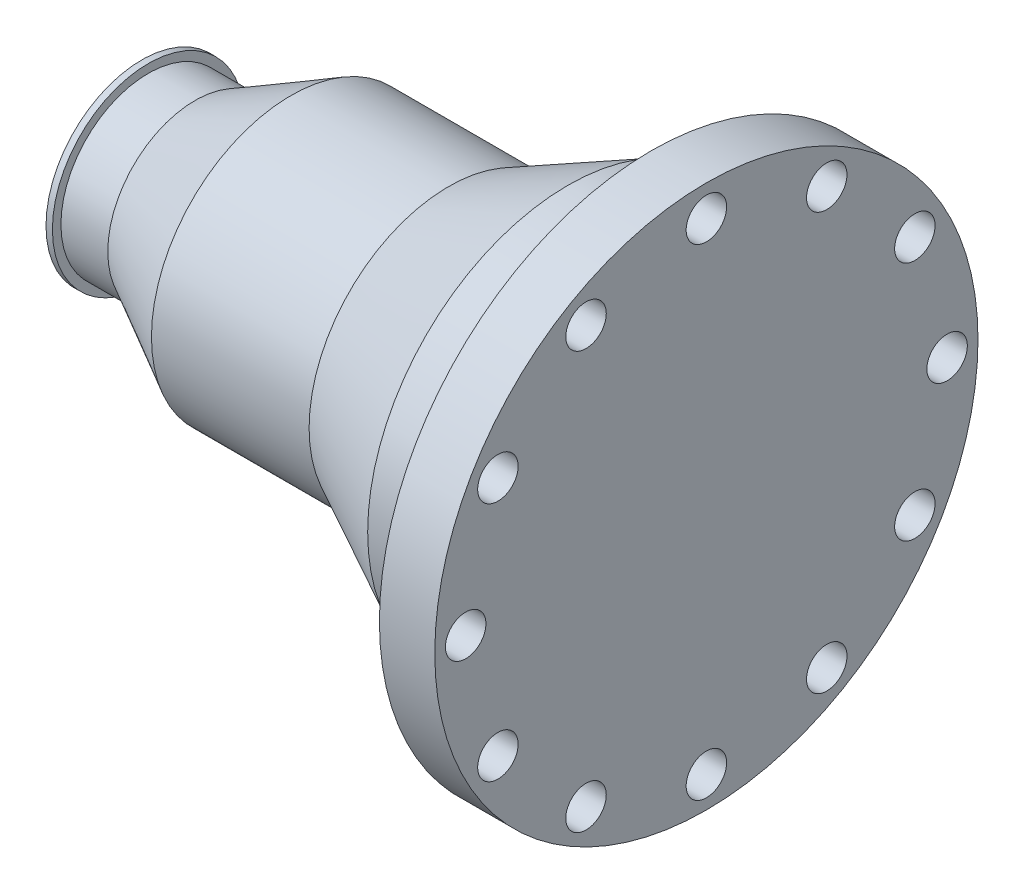
ISO-10303-21;
HEADER;
FILE_DESCRIPTION(('STEP AP214'),'2;1');
FILE_NAME('part.step','',(''),(''),'','','');
FILE_SCHEMA(('AUTOMOTIVE_DESIGN { 1 0 10303 214 1 1 1 1 }'));
ENDSEC;
DATA;
#1=APPLICATION_CONTEXT('core data for automotive mechanical design processes');
#2=APPLICATION_PROTOCOL_DEFINITION('international standard','automotive_design',2000,#1);
#3=PRODUCT_CONTEXT('',#1,'mechanical');
#4=PRODUCT('Part','Part','',(#3));
#5=PRODUCT_RELATED_PRODUCT_CATEGORY('part','',(#4));
#6=PRODUCT_DEFINITION_FORMATION('','',#4);
#7=PRODUCT_DEFINITION_CONTEXT('part definition',#1,'design');
#8=PRODUCT_DEFINITION('design','',#6,#7);
#9=PRODUCT_DEFINITION_SHAPE('','',#8);
#10=(LENGTH_UNIT() NAMED_UNIT(*) SI_UNIT(.MILLI.,.METRE.));
#11=(NAMED_UNIT(*) PLANE_ANGLE_UNIT() SI_UNIT($,.RADIAN.));
#12=(NAMED_UNIT(*) SI_UNIT($,.STERADIAN.) SOLID_ANGLE_UNIT());
#13=UNCERTAINTY_MEASURE_WITH_UNIT(LENGTH_MEASURE(1.E-05),#10,'distance_accuracy_value','');
#14=(GEOMETRIC_REPRESENTATION_CONTEXT(3) GLOBAL_UNCERTAINTY_ASSIGNED_CONTEXT((#13)) GLOBAL_UNIT_ASSIGNED_CONTEXT((#10,
#11,#12)) REPRESENTATION_CONTEXT('',''));
#15=CARTESIAN_POINT('',(0.,0.,0.));
#16=DIRECTION('',(0.,0.,1.));
#17=DIRECTION('',(1.,0.,0.));
#18=AXIS2_PLACEMENT_3D('',#15,#16,#17);
#19=CARTESIAN_POINT('',(0.,0.,0.));
#20=DIRECTION('',(1.,0.,0.));
#21=DIRECTION('',(0.,0.,-1.));
#22=AXIS2_PLACEMENT_3D('',#19,#20,#21);
#23=PLANE('',#22);
#24=CARTESIAN_POINT('',(0.,0.,0.));
#25=DIRECTION('',(-1.,0.,0.));
#26=DIRECTION('',(0.,0.,1.));
#27=AXIS2_PLACEMENT_3D('',#24,#25,#26);
#28=CIRCLE('',#27,31.);
#29=CARTESIAN_POINT('',(0.,0.,31.));
#30=VERTEX_POINT('',#29);
#31=EDGE_CURVE('E80',#30,#30,#28,.T.);
#32=ORIENTED_EDGE('',*,*,#31,.F.);
#33=EDGE_LOOP('',(#32));
#34=FACE_BOUND('',#33,.T.);
#35=CARTESIAN_POINT('',(0.,0.,0.));
#36=DIRECTION('',(-1.,0.,0.));
#37=DIRECTION('',(0.,0.,1.));
#38=AXIS2_PLACEMENT_3D('',#35,#36,#37);
#39=CIRCLE('',#38,45.);
#40=CARTESIAN_POINT('',(0.,0.,45.));
#41=VERTEX_POINT('',#40);
#42=EDGE_CURVE('E10',#41,#41,#39,.T.);
#43=ORIENTED_EDGE('',*,*,#42,.T.);
#44=EDGE_LOOP('',(#43));
#45=FACE_BOUND('',#44,.T.);
#46=ADVANCED_FACE('F37',(#34,#45),#23,.F.);
#47=CARTESIAN_POINT('',(0.,0.,0.));
#48=DIRECTION('',(-1.,0.,0.));
#49=DIRECTION('',(0.,0.,1.));
#50=AXIS2_PLACEMENT_3D('',#47,#48,#49);
#51=CYLINDRICAL_SURFACE('',#50,45.);
#52=ORIENTED_EDGE('',*,*,#42,.F.);
#53=EDGE_LOOP('',(#52));
#54=FACE_BOUND('',#53,.T.);
#55=CARTESIAN_POINT('',(3.,0.,0.));
#56=DIRECTION('',(-1.,0.,0.));
#57=DIRECTION('',(0.,0.,1.));
#58=AXIS2_PLACEMENT_3D('',#55,#56,#57);
#59=CIRCLE('',#58,45.);
#60=CARTESIAN_POINT('',(3.,0.,45.));
#61=VERTEX_POINT('',#60);
#62=EDGE_CURVE('E43',#61,#61,#59,.T.);
#63=ORIENTED_EDGE('',*,*,#62,.T.);
#64=EDGE_LOOP('',(#63));
#65=FACE_BOUND('',#64,.T.);
#66=ADVANCED_FACE('F226',(#54,#65),#51,.T.);
#67=CARTESIAN_POINT('',(3.,45.,0.));
#68=DIRECTION('',(-1.,0.,0.));
#69=DIRECTION('',(0.,0.,1.));
#70=AXIS2_PLACEMENT_3D('',#67,#68,#69);
#71=PLANE('',#70);
#72=ORIENTED_EDGE('',*,*,#62,.F.);
#73=EDGE_LOOP('',(#72));
#74=FACE_BOUND('',#73,.T.);
#75=CARTESIAN_POINT('',(3.,0.,0.));
#76=DIRECTION('',(-1.,0.,0.));
#77=DIRECTION('',(0.,0.,1.));
#78=AXIS2_PLACEMENT_3D('',#75,#76,#77);
#79=CIRCLE('',#78,41.);
#80=CARTESIAN_POINT('',(3.,0.,41.));
#81=VERTEX_POINT('',#80);
#82=EDGE_CURVE('E47',#81,#81,#79,.T.);
#83=ORIENTED_EDGE('',*,*,#82,.T.);
#84=EDGE_LOOP('',(#83));
#85=FACE_BOUND('',#84,.T.);
#86=ADVANCED_FACE('F232',(#74,#85),#71,.F.);
#87=CARTESIAN_POINT('',(0.,0.,0.));
#88=DIRECTION('',(-1.,0.,0.));
#89=DIRECTION('',(0.,0.,1.));
#90=AXIS2_PLACEMENT_3D('',#87,#88,#89);
#91=CYLINDRICAL_SURFACE('',#90,41.);
#92=ORIENTED_EDGE('',*,*,#82,.F.);
#93=EDGE_LOOP('',(#92));
#94=FACE_BOUND('',#93,.T.);
#95=CARTESIAN_POINT('',(25.,0.,0.));
#96=DIRECTION('',(-1.,0.,0.));
#97=DIRECTION('',(0.,0.,1.));
#98=AXIS2_PLACEMENT_3D('',#95,#96,#97);
#99=CIRCLE('',#98,41.);
#100=CARTESIAN_POINT('',(25.,0.,41.));
#101=VERTEX_POINT('',#100);
#102=EDGE_CURVE('E51',#101,#101,#99,.T.);
#103=ORIENTED_EDGE('',*,*,#102,.T.);
#104=EDGE_LOOP('',(#103));
#105=FACE_BOUND('',#104,.T.);
#106=ADVANCED_FACE('F514',(#94,#105),#91,.T.);
#107=CARTESIAN_POINT('',(70.,0.,0.));
#108=DIRECTION('',(1.,0.,0.));
#109=DIRECTION('',(0.,0.,-1.));
#110=AXIS2_PLACEMENT_3D('',#107,#108,#109);
#111=CONICAL_SURFACE('',#110,65.5,0.498567905638218);
#112=ORIENTED_EDGE('',*,*,#102,.F.);
#113=EDGE_LOOP('',(#112));
#114=FACE_BOUND('',#113,.T.);
#115=CARTESIAN_POINT('',(70.,0.,0.));
#116=DIRECTION('',(-1.,0.,0.));
#117=DIRECTION('',(0.,0.,1.));
#118=AXIS2_PLACEMENT_3D('',#115,#116,#117);
#119=CIRCLE('',#118,65.5);
#120=CARTESIAN_POINT('',(70.,0.,65.5));
#121=VERTEX_POINT('',#120);
#122=EDGE_CURVE('E56',#121,#121,#119,.T.);
#123=ORIENTED_EDGE('',*,*,#122,.T.);
#124=EDGE_LOOP('',(#123));
#125=FACE_BOUND('',#124,.T.);
#126=ADVANCED_FACE('F505',(#114,#125),#111,.T.);
#127=CARTESIAN_POINT('',(0.,0.,0.));
#128=DIRECTION('',(-1.,0.,0.));
#129=DIRECTION('',(0.,0.,1.));
#130=AXIS2_PLACEMENT_3D('',#127,#128,#129);
#131=CYLINDRICAL_SURFACE('',#130,65.5);
#132=ORIENTED_EDGE('',*,*,#122,.F.);
#133=EDGE_LOOP('',(#132));
#134=FACE_BOUND('',#133,.T.);
#135=CARTESIAN_POINT('',(144.,0.,0.));
#136=DIRECTION('',(-1.,0.,0.));
#137=DIRECTION('',(0.,0.,1.));
#138=AXIS2_PLACEMENT_3D('',#135,#136,#137);
#139=CIRCLE('',#138,65.5);
#140=CARTESIAN_POINT('',(144.,0.,65.5));
#141=VERTEX_POINT('',#140);
#142=EDGE_CURVE('E59',#141,#141,#139,.T.);
#143=ORIENTED_EDGE('',*,*,#142,.T.);
#144=EDGE_LOOP('',(#143));
#145=FACE_BOUND('',#144,.T.);
#146=ADVANCED_FACE('F496',(#134,#145),#131,.T.);
#147=CARTESIAN_POINT('',(200.,0.,0.));
#148=DIRECTION('',(1.,0.,0.));
#149=DIRECTION('',(0.,0.,-1.));
#150=AXIS2_PLACEMENT_3D('',#147,#148,#149);
#151=CONICAL_SURFACE('',#150,94.,0.470764926542016);
#152=ORIENTED_EDGE('',*,*,#142,.F.);
#153=EDGE_LOOP('',(#152));
#154=FACE_BOUND('',#153,.T.);
#155=CARTESIAN_POINT('',(200.,0.,0.));
#156=DIRECTION('',(-1.,0.,0.));
#157=DIRECTION('',(0.,0.,1.));
#158=AXIS2_PLACEMENT_3D('',#155,#156,#157);
#159=CIRCLE('',#158,94.);
#160=CARTESIAN_POINT('',(200.,0.,94.));
#161=VERTEX_POINT('',#160);
#162=EDGE_CURVE('E62',#161,#161,#159,.T.);
#163=ORIENTED_EDGE('',*,*,#162,.T.);
#164=EDGE_LOOP('',(#163));
#165=FACE_BOUND('',#164,.T.);
#166=ADVANCED_FACE('F487',(#154,#165),#151,.T.);
#167=CARTESIAN_POINT('',(0.,0.,0.));
#168=DIRECTION('',(-1.,0.,0.));
#169=DIRECTION('',(0.,0.,1.));
#170=AXIS2_PLACEMENT_3D('',#167,#168,#169);
#171=CYLINDRICAL_SURFACE('',#170,94.);
#172=ORIENTED_EDGE('',*,*,#162,.F.);
#173=EDGE_LOOP('',(#172));
#174=FACE_BOUND('',#173,.T.);
#175=CARTESIAN_POINT('',(220.,0.,0.));
#176=DIRECTION('',(-1.,0.,0.));
#177=DIRECTION('',(0.,0.,1.));
#178=AXIS2_PLACEMENT_3D('',#175,#176,#177);
#179=CIRCLE('',#178,94.);
#180=CARTESIAN_POINT('',(220.,0.,94.));
#181=VERTEX_POINT('',#180);
#182=EDGE_CURVE('E65',#181,#181,#179,.T.);
#183=ORIENTED_EDGE('',*,*,#182,.T.);
#184=EDGE_LOOP('',(#183));
#185=FACE_BOUND('',#184,.T.);
#186=ADVANCED_FACE('F478',(#174,#185),#171,.T.);
#187=CARTESIAN_POINT('',(220.,94.,0.));
#188=DIRECTION('',(1.,0.,0.));
#189=DIRECTION('',(0.,0.,-1.));
#190=AXIS2_PLACEMENT_3D('',#187,#188,#189);
#191=PLANE('',#190);
#192=ORIENTED_EDGE('',*,*,#182,.F.);
#193=EDGE_LOOP('',(#192));
#194=FACE_BOUND('',#193,.T.);
#195=CARTESIAN_POINT('',(220.,0.,0.));
#196=DIRECTION('',(-1.,0.,0.));
#197=DIRECTION('',(0.,0.,1.));
#198=AXIS2_PLACEMENT_3D('',#195,#196,#197);
#199=CIRCLE('',#198,95.);
#200=CARTESIAN_POINT('',(220.,0.,95.));
#201=VERTEX_POINT('',#200);
#202=EDGE_CURVE('E68',#201,#201,#199,.T.);
#203=ORIENTED_EDGE('',*,*,#202,.T.);
#204=EDGE_LOOP('',(#203));
#205=FACE_BOUND('',#204,.T.);
#206=ADVANCED_FACE('F469',(#194,#205),#191,.F.);
#207=CARTESIAN_POINT('',(0.,0.,0.));
#208=DIRECTION('',(-1.,0.,0.));
#209=DIRECTION('',(0.,0.,1.));
#210=AXIS2_PLACEMENT_3D('',#207,#208,#209);
#211=CYLINDRICAL_SURFACE('',#210,95.);
#212=ORIENTED_EDGE('',*,*,#202,.F.);
#213=EDGE_LOOP('',(#212));
#214=FACE_BOUND('',#213,.T.);
#215=CARTESIAN_POINT('',(239.,0.,0.));
#216=DIRECTION('',(-1.,0.,0.));
#217=DIRECTION('',(0.,0.,1.));
#218=AXIS2_PLACEMENT_3D('',#215,#216,#217);
#219=CIRCLE('',#218,95.);
#220=CARTESIAN_POINT('',(239.,0.,95.));
#221=VERTEX_POINT('',#220);
#222=EDGE_CURVE('E71',#221,#221,#219,.T.);
#223=ORIENTED_EDGE('',*,*,#222,.T.);
#224=EDGE_LOOP('',(#223));
#225=FACE_BOUND('',#224,.T.);
#226=ADVANCED_FACE('F222',(#214,#225),#211,.T.);
#227=CARTESIAN_POINT('',(239.,100.,0.));
#228=DIRECTION('',(1.,0.,0.));
#229=DIRECTION('',(0.,0.,-1.));
#230=AXIS2_PLACEMENT_3D('',#227,#228,#229);
#231=PLANE('',#230);
#232=CARTESIAN_POINT('',(239.,97.8608706276416,-56.5));
#233=DIRECTION('',(1.,0.,0.));
#234=DIRECTION('',(0.,0.,-1.));
#235=AXIS2_PLACEMENT_3D('',#232,#233,#234);
#236=CIRCLE('',#235,9.50000000000001);
#237=CARTESIAN_POINT('',(239.,97.8608706276416,-66.));
#238=VERTEX_POINT('',#237);
#239=EDGE_CURVE('E173',#238,#238,#236,.F.);
#240=ORIENTED_EDGE('',*,*,#239,.F.);
#241=EDGE_LOOP('',(#240));
#242=FACE_BOUND('',#241,.T.);
#243=CARTESIAN_POINT('',(239.,56.4999999999999,-97.8608706276416));
#244=DIRECTION('',(1.,0.,0.));
#245=DIRECTION('',(0.,0.,-1.));
#246=AXIS2_PLACEMENT_3D('',#243,#244,#245);
#247=CIRCLE('',#246,9.5);
#248=CARTESIAN_POINT('',(239.,56.4999999999999,-107.360870627642));
#249=VERTEX_POINT('',#248);
#250=EDGE_CURVE('E167',#249,#249,#247,.F.);
#251=ORIENTED_EDGE('',*,*,#250,.F.);
#252=EDGE_LOOP('',(#251));
#253=FACE_BOUND('',#252,.T.);
#254=CARTESIAN_POINT('',(239.,0.,-113.));
#255=DIRECTION('',(1.,0.,0.));
#256=DIRECTION('',(0.,0.,-1.));
#257=AXIS2_PLACEMENT_3D('',#254,#255,#256);
#258=CIRCLE('',#257,9.49999999999999);
#259=CARTESIAN_POINT('',(239.,0.,-122.5));
#260=VERTEX_POINT('',#259);
#261=EDGE_CURVE('E161',#260,#260,#258,.F.);
#262=ORIENTED_EDGE('',*,*,#261,.F.);
#263=EDGE_LOOP('',(#262));
#264=FACE_BOUND('',#263,.T.);
#265=CARTESIAN_POINT('',(239.,-56.5,-97.8608706276415));
#266=DIRECTION('',(1.,0.,0.));
#267=DIRECTION('',(0.,0.,-1.));
#268=AXIS2_PLACEMENT_3D('',#265,#266,#267);
#269=CIRCLE('',#268,9.5);
#270=CARTESIAN_POINT('',(239.,-56.5,-107.360870627642));
#271=VERTEX_POINT('',#270);
#272=EDGE_CURVE('E155',#271,#271,#269,.F.);
#273=ORIENTED_EDGE('',*,*,#272,.F.);
#274=EDGE_LOOP('',(#273));
#275=FACE_BOUND('',#274,.T.);
#276=CARTESIAN_POINT('',(239.,-97.8608706276416,-56.5));
#277=DIRECTION('',(1.,0.,0.));
#278=DIRECTION('',(0.,0.,-1.));
#279=AXIS2_PLACEMENT_3D('',#276,#277,#278);
#280=CIRCLE('',#279,9.50000000000001);
#281=CARTESIAN_POINT('',(239.,-97.8608706276416,-66.));
#282=VERTEX_POINT('',#281);
#283=EDGE_CURVE('E149',#282,#282,#280,.F.);
#284=ORIENTED_EDGE('',*,*,#283,.F.);
#285=EDGE_LOOP('',(#284));
#286=FACE_BOUND('',#285,.T.);
#287=CARTESIAN_POINT('',(239.,-113.,0.));
#288=DIRECTION('',(1.,0.,0.));
#289=DIRECTION('',(0.,0.,-1.));
#290=AXIS2_PLACEMENT_3D('',#287,#288,#289);
#291=CIRCLE('',#290,9.49999999999998);
#292=CARTESIAN_POINT('',(239.,-113.,-9.49999999999998));
#293=VERTEX_POINT('',#292);
#294=EDGE_CURVE('E143',#293,#293,#291,.F.);
#295=ORIENTED_EDGE('',*,*,#294,.F.);
#296=EDGE_LOOP('',(#295));
#297=FACE_BOUND('',#296,.T.);
#298=CARTESIAN_POINT('',(239.,-97.8608706276415,56.5));
#299=DIRECTION('',(1.,0.,0.));
#300=DIRECTION('',(0.,0.,-1.));
#301=AXIS2_PLACEMENT_3D('',#298,#299,#300);
#302=CIRCLE('',#301,9.5);
#303=CARTESIAN_POINT('',(239.,-97.8608706276415,47.));
#304=VERTEX_POINT('',#303);
#305=EDGE_CURVE('E137',#304,#304,#302,.F.);
#306=ORIENTED_EDGE('',*,*,#305,.F.);
#307=EDGE_LOOP('',(#306));
#308=FACE_BOUND('',#307,.T.);
#309=CARTESIAN_POINT('',(239.,-56.5,97.8608706276416));
#310=DIRECTION('',(1.,0.,0.));
#311=DIRECTION('',(0.,0.,-1.));
#312=AXIS2_PLACEMENT_3D('',#309,#310,#311);
#313=CIRCLE('',#312,9.5);
#314=CARTESIAN_POINT('',(239.,-56.5,88.3608706276416));
#315=VERTEX_POINT('',#314);
#316=EDGE_CURVE('E131',#315,#315,#313,.F.);
#317=ORIENTED_EDGE('',*,*,#316,.F.);
#318=EDGE_LOOP('',(#317));
#319=FACE_BOUND('',#318,.T.);
#320=CARTESIAN_POINT('',(239.,0.,113.));
#321=DIRECTION('',(1.,0.,0.));
#322=DIRECTION('',(0.,0.,-1.));
#323=AXIS2_PLACEMENT_3D('',#320,#321,#322);
#324=CIRCLE('',#323,9.49999999999999);
#325=CARTESIAN_POINT('',(239.,0.,103.5));
#326=VERTEX_POINT('',#325);
#327=EDGE_CURVE('E125',#326,#326,#324,.F.);
#328=ORIENTED_EDGE('',*,*,#327,.F.);
#329=EDGE_LOOP('',(#328));
#330=FACE_BOUND('',#329,.T.);
#331=CARTESIAN_POINT('',(239.,56.5,97.8608706276416));
#332=DIRECTION('',(1.,0.,0.));
#333=DIRECTION('',(0.,0.,-1.));
#334=AXIS2_PLACEMENT_3D('',#331,#332,#333);
#335=CIRCLE('',#334,9.5);
#336=CARTESIAN_POINT('',(239.,56.5,88.3608706276416));
#337=VERTEX_POINT('',#336);
#338=EDGE_CURVE('E119',#337,#337,#335,.F.);
#339=ORIENTED_EDGE('',*,*,#338,.F.);
#340=EDGE_LOOP('',(#339));
#341=FACE_BOUND('',#340,.T.);
#342=CARTESIAN_POINT('',(239.,97.8608706276416,56.5));
#343=DIRECTION('',(1.,0.,0.));
#344=DIRECTION('',(0.,0.,-1.));
#345=AXIS2_PLACEMENT_3D('',#342,#343,#344);
#346=CIRCLE('',#345,9.5);
#347=CARTESIAN_POINT('',(239.,97.8608706276416,47.));
#348=VERTEX_POINT('',#347);
#349=EDGE_CURVE('E113',#348,#348,#346,.F.);
#350=ORIENTED_EDGE('',*,*,#349,.F.);
#351=EDGE_LOOP('',(#350));
#352=FACE_BOUND('',#351,.T.);
#353=CARTESIAN_POINT('',(239.,113.,0.));
#354=DIRECTION('',(1.,0.,0.));
#355=DIRECTION('',(0.,0.,-1.));
#356=AXIS2_PLACEMENT_3D('',#353,#354,#355);
#357=CIRCLE('',#356,9.50000000000001);
#358=CARTESIAN_POINT('',(239.,113.,-9.50000000000001));
#359=VERTEX_POINT('',#358);
#360=EDGE_CURVE('E107',#359,#359,#357,.F.);
#361=ORIENTED_EDGE('',*,*,#360,.F.);
#362=EDGE_LOOP('',(#361));
#363=FACE_BOUND('',#362,.T.);
#364=ORIENTED_EDGE('',*,*,#222,.F.);
#365=EDGE_LOOP('',(#364));
#366=FACE_BOUND('',#365,.T.);
#367=CARTESIAN_POINT('',(239.,0.,0.));
#368=DIRECTION('',(-1.,0.,0.));
#369=DIRECTION('',(0.,0.,1.));
#370=AXIS2_PLACEMENT_3D('',#367,#368,#369);
#371=CIRCLE('',#370,127.5);
#372=CARTESIAN_POINT('',(239.,0.,127.5));
#373=VERTEX_POINT('',#372);
#374=EDGE_CURVE('E74',#373,#373,#371,.T.);
#375=ORIENTED_EDGE('',*,*,#374,.T.);
#376=EDGE_LOOP('',(#375));
#377=FACE_BOUND('',#376,.T.);
#378=ADVANCED_FACE('F214',(#242,#253,#264,#275,#286,#297,#308,#319,#330,#341,#352,#363,#366,
#377),#231,.F.);
#379=CARTESIAN_POINT('',(0.,0.,0.));
#380=DIRECTION('',(-1.,0.,0.));
#381=DIRECTION('',(0.,0.,1.));
#382=AXIS2_PLACEMENT_3D('',#379,#380,#381);
#383=CYLINDRICAL_SURFACE('',#382,127.5);
#384=ORIENTED_EDGE('',*,*,#374,.F.);
#385=EDGE_LOOP('',(#384));
#386=FACE_BOUND('',#385,.T.);
#387=CARTESIAN_POINT('',(265.,0.,0.));
#388=DIRECTION('',(-1.,0.,0.));
#389=DIRECTION('',(0.,0.,1.));
#390=AXIS2_PLACEMENT_3D('',#387,#388,#389);
#391=CIRCLE('',#390,127.5);
#392=CARTESIAN_POINT('',(265.,0.,127.5));
#393=VERTEX_POINT('',#392);
#394=EDGE_CURVE('E77',#393,#393,#391,.T.);
#395=ORIENTED_EDGE('',*,*,#394,.T.);
#396=EDGE_LOOP('',(#395));
#397=FACE_BOUND('',#396,.T.);
#398=ADVANCED_FACE('F187',(#386,#397),#383,.T.);
#399=CARTESIAN_POINT('',(265.,127.5,0.));
#400=DIRECTION('',(-1.,0.,0.));
#401=DIRECTION('',(0.,0.,1.));
#402=AXIS2_PLACEMENT_3D('',#399,#400,#401);
#403=PLANE('',#402);
#404=CARTESIAN_POINT('',(265.,97.8608706276416,-56.5));
#405=DIRECTION('',(1.,0.,0.));
#406=DIRECTION('',(0.,0.,-1.));
#407=AXIS2_PLACEMENT_3D('',#404,#405,#406);
#408=CIRCLE('',#407,9.50000000000001);
#409=CARTESIAN_POINT('',(265.,97.8608706276416,-66.));
#410=VERTEX_POINT('',#409);
#411=EDGE_CURVE('E176',#410,#410,#408,.T.);
#412=ORIENTED_EDGE('',*,*,#411,.F.);
#413=EDGE_LOOP('',(#412));
#414=FACE_BOUND('',#413,.T.);
#415=CARTESIAN_POINT('',(265.,56.4999999999999,-97.8608706276416));
#416=DIRECTION('',(1.,0.,0.));
#417=DIRECTION('',(0.,0.,-1.));
#418=AXIS2_PLACEMENT_3D('',#415,#416,#417);
#419=CIRCLE('',#418,9.5);
#420=CARTESIAN_POINT('',(265.,56.4999999999999,-107.360870627642));
#421=VERTEX_POINT('',#420);
#422=EDGE_CURVE('E170',#421,#421,#419,.T.);
#423=ORIENTED_EDGE('',*,*,#422,.F.);
#424=EDGE_LOOP('',(#423));
#425=FACE_BOUND('',#424,.T.);
#426=CARTESIAN_POINT('',(265.,0.,-113.));
#427=DIRECTION('',(1.,0.,0.));
#428=DIRECTION('',(0.,0.,-1.));
#429=AXIS2_PLACEMENT_3D('',#426,#427,#428);
#430=CIRCLE('',#429,9.49999999999999);
#431=CARTESIAN_POINT('',(265.,0.,-122.5));
#432=VERTEX_POINT('',#431);
#433=EDGE_CURVE('E164',#432,#432,#430,.T.);
#434=ORIENTED_EDGE('',*,*,#433,.F.);
#435=EDGE_LOOP('',(#434));
#436=FACE_BOUND('',#435,.T.);
#437=CARTESIAN_POINT('',(265.,-56.5,-97.8608706276415));
#438=DIRECTION('',(1.,0.,0.));
#439=DIRECTION('',(0.,0.,-1.));
#440=AXIS2_PLACEMENT_3D('',#437,#438,#439);
#441=CIRCLE('',#440,9.5);
#442=CARTESIAN_POINT('',(265.,-56.5,-107.360870627642));
#443=VERTEX_POINT('',#442);
#444=EDGE_CURVE('E158',#443,#443,#441,.T.);
#445=ORIENTED_EDGE('',*,*,#444,.F.);
#446=EDGE_LOOP('',(#445));
#447=FACE_BOUND('',#446,.T.);
#448=CARTESIAN_POINT('',(265.,-97.8608706276416,-56.5));
#449=DIRECTION('',(1.,0.,0.));
#450=DIRECTION('',(0.,0.,-1.));
#451=AXIS2_PLACEMENT_3D('',#448,#449,#450);
#452=CIRCLE('',#451,9.50000000000001);
#453=CARTESIAN_POINT('',(265.,-97.8608706276416,-66.));
#454=VERTEX_POINT('',#453);
#455=EDGE_CURVE('E152',#454,#454,#452,.T.);
#456=ORIENTED_EDGE('',*,*,#455,.F.);
#457=EDGE_LOOP('',(#456));
#458=FACE_BOUND('',#457,.T.);
#459=CARTESIAN_POINT('',(265.,-113.,0.));
#460=DIRECTION('',(1.,0.,0.));
#461=DIRECTION('',(0.,0.,-1.));
#462=AXIS2_PLACEMENT_3D('',#459,#460,#461);
#463=CIRCLE('',#462,9.49999999999998);
#464=CARTESIAN_POINT('',(265.,-113.,-9.49999999999998));
#465=VERTEX_POINT('',#464);
#466=EDGE_CURVE('E146',#465,#465,#463,.T.);
#467=ORIENTED_EDGE('',*,*,#466,.F.);
#468=EDGE_LOOP('',(#467));
#469=FACE_BOUND('',#468,.T.);
#470=CARTESIAN_POINT('',(265.,-97.8608706276415,56.5));
#471=DIRECTION('',(1.,0.,0.));
#472=DIRECTION('',(0.,0.,-1.));
#473=AXIS2_PLACEMENT_3D('',#470,#471,#472);
#474=CIRCLE('',#473,9.5);
#475=CARTESIAN_POINT('',(265.,-97.8608706276415,47.));
#476=VERTEX_POINT('',#475);
#477=EDGE_CURVE('E140',#476,#476,#474,.T.);
#478=ORIENTED_EDGE('',*,*,#477,.F.);
#479=EDGE_LOOP('',(#478));
#480=FACE_BOUND('',#479,.T.);
#481=CARTESIAN_POINT('',(265.,-56.5,97.8608706276416));
#482=DIRECTION('',(1.,0.,0.));
#483=DIRECTION('',(0.,0.,-1.));
#484=AXIS2_PLACEMENT_3D('',#481,#482,#483);
#485=CIRCLE('',#484,9.5);
#486=CARTESIAN_POINT('',(265.,-56.5,88.3608706276416));
#487=VERTEX_POINT('',#486);
#488=EDGE_CURVE('E134',#487,#487,#485,.T.);
#489=ORIENTED_EDGE('',*,*,#488,.F.);
#490=EDGE_LOOP('',(#489));
#491=FACE_BOUND('',#490,.T.);
#492=CARTESIAN_POINT('',(265.,0.,113.));
#493=DIRECTION('',(1.,0.,0.));
#494=DIRECTION('',(0.,0.,-1.));
#495=AXIS2_PLACEMENT_3D('',#492,#493,#494);
#496=CIRCLE('',#495,9.49999999999999);
#497=CARTESIAN_POINT('',(265.,0.,103.5));
#498=VERTEX_POINT('',#497);
#499=EDGE_CURVE('E128',#498,#498,#496,.T.);
#500=ORIENTED_EDGE('',*,*,#499,.F.);
#501=EDGE_LOOP('',(#500));
#502=FACE_BOUND('',#501,.T.);
#503=CARTESIAN_POINT('',(265.,56.5,97.8608706276416));
#504=DIRECTION('',(1.,0.,0.));
#505=DIRECTION('',(0.,0.,-1.));
#506=AXIS2_PLACEMENT_3D('',#503,#504,#505);
#507=CIRCLE('',#506,9.5);
#508=CARTESIAN_POINT('',(265.,56.5,88.3608706276416));
#509=VERTEX_POINT('',#508);
#510=EDGE_CURVE('E122',#509,#509,#507,.T.);
#511=ORIENTED_EDGE('',*,*,#510,.F.);
#512=EDGE_LOOP('',(#511));
#513=FACE_BOUND('',#512,.T.);
#514=CARTESIAN_POINT('',(265.,97.8608706276416,56.5));
#515=DIRECTION('',(1.,0.,0.));
#516=DIRECTION('',(0.,0.,-1.));
#517=AXIS2_PLACEMENT_3D('',#514,#515,#516);
#518=CIRCLE('',#517,9.5);
#519=CARTESIAN_POINT('',(265.,97.8608706276416,47.));
#520=VERTEX_POINT('',#519);
#521=EDGE_CURVE('E116',#520,#520,#518,.T.);
#522=ORIENTED_EDGE('',*,*,#521,.F.);
#523=EDGE_LOOP('',(#522));
#524=FACE_BOUND('',#523,.T.);
#525=CARTESIAN_POINT('',(265.,113.,0.));
#526=DIRECTION('',(1.,0.,0.));
#527=DIRECTION('',(0.,0.,-1.));
#528=AXIS2_PLACEMENT_3D('',#525,#526,#527);
#529=CIRCLE('',#528,9.50000000000001);
#530=CARTESIAN_POINT('',(265.,113.,-9.50000000000001));
#531=VERTEX_POINT('',#530);
#532=EDGE_CURVE('E110',#531,#531,#529,.T.);
#533=ORIENTED_EDGE('',*,*,#532,.F.);
#534=EDGE_LOOP('',(#533));
#535=FACE_BOUND('',#534,.T.);
#536=ORIENTED_EDGE('',*,*,#394,.F.);
#537=EDGE_LOOP('',(#536));
#538=FACE_BOUND('',#537,.T.);
#539=ADVANCED_FACE('F183',(#414,#425,#436,#447,#458,#469,#480,#491,#502,#513,#524,#535,#538),
#403,.F.);
#540=CARTESIAN_POINT('',(0.,0.,0.));
#541=DIRECTION('',(-1.,0.,0.));
#542=DIRECTION('',(0.,0.,1.));
#543=AXIS2_PLACEMENT_3D('',#540,#541,#542);
#544=CYLINDRICAL_SURFACE('',#543,31.);
#545=ORIENTED_EDGE('',*,*,#31,.T.);
#546=EDGE_LOOP('',(#545));
#547=FACE_BOUND('',#546,.T.);
#548=CARTESIAN_POINT('',(42.,0.,0.));
#549=DIRECTION('',(-1.,0.,0.));
#550=DIRECTION('',(0.,0.,1.));
#551=AXIS2_PLACEMENT_3D('',#548,#549,#550);
#552=CIRCLE('',#551,31.);
#553=CARTESIAN_POINT('',(42.,0.,31.));
#554=VERTEX_POINT('',#553);
#555=EDGE_CURVE('E83',#554,#554,#552,.T.);
#556=ORIENTED_EDGE('',*,*,#555,.F.);
#557=EDGE_LOOP('',(#556));
#558=FACE_BOUND('',#557,.T.);
#559=ADVANCED_FACE('F186',(#547,#558),#544,.F.);
#560=CARTESIAN_POINT('',(70.,0.,0.));
#561=DIRECTION('',(1.,0.,0.));
#562=DIRECTION('',(0.,0.,-1.));
#563=AXIS2_PLACEMENT_3D('',#560,#561,#562);
#564=CONICAL_SURFACE('',#563,38.502577,0.261799374867879);
#565=ORIENTED_EDGE('',*,*,#555,.T.);
#566=EDGE_LOOP('',(#565));
#567=FACE_BOUND('',#566,.T.);
#568=CARTESIAN_POINT('',(70.,0.,0.));
#569=DIRECTION('',(-1.,0.,0.));
#570=DIRECTION('',(0.,0.,1.));
#571=AXIS2_PLACEMENT_3D('',#568,#569,#570);
#572=CIRCLE('',#571,38.502577);
#573=CARTESIAN_POINT('',(70.,0.,38.502577));
#574=VERTEX_POINT('',#573);
#575=EDGE_CURVE('E86',#574,#574,#572,.T.);
#576=ORIENTED_EDGE('',*,*,#575,.F.);
#577=EDGE_LOOP('',(#576));
#578=FACE_BOUND('',#577,.T.);
#579=ADVANCED_FACE('F237',(#567,#578),#564,.F.);
#580=CARTESIAN_POINT('',(107.802202951022,0.,0.));
#581=DIRECTION('',(-1.,0.,0.));
#582=DIRECTION('',(0.,0.,1.));
#583=AXIS2_PLACEMENT_3D('',#580,#581,#582);
#584=DEGENERATE_TOROIDAL_SURFACE('',#583,5.77654352226822,49.9999981513586,.T.);
#585=ORIENTED_EDGE('',*,*,#575,.T.);
#586=EDGE_LOOP('',(#585));
#587=FACE_BOUND('',#586,.T.);
#588=CARTESIAN_POINT('',(90.,0.,0.));
#589=DIRECTION('',(-1.,0.,0.));
#590=DIRECTION('',(0.,0.,1.));
#591=AXIS2_PLACEMENT_3D('',#588,#589,#590);
#592=CIRCLE('',#591,52.5);
#593=CARTESIAN_POINT('',(90.,0.,52.5));
#594=VERTEX_POINT('',#593);
#595=EDGE_CURVE('E89',#594,#594,#592,.T.);
#596=ORIENTED_EDGE('',*,*,#595,.F.);
#597=EDGE_LOOP('',(#596));
#598=FACE_BOUND('',#597,.T.);
#599=ADVANCED_FACE('F243',(#587,#598),#584,.F.);
#600=CARTESIAN_POINT('',(0.,0.,0.));
#601=DIRECTION('',(-1.,0.,0.));
#602=DIRECTION('',(0.,0.,1.));
#603=AXIS2_PLACEMENT_3D('',#600,#601,#602);
#604=CYLINDRICAL_SURFACE('',#603,52.5);
#605=ORIENTED_EDGE('',*,*,#595,.T.);
#606=EDGE_LOOP('',(#605));
#607=FACE_BOUND('',#606,.T.);
#608=CARTESIAN_POINT('',(142.,0.,0.));
#609=DIRECTION('',(-1.,0.,0.));
#610=DIRECTION('',(0.,0.,1.));
#611=AXIS2_PLACEMENT_3D('',#608,#609,#610);
#612=CIRCLE('',#611,52.5);
#613=CARTESIAN_POINT('',(142.,0.,52.5));
#614=VERTEX_POINT('',#613);
#615=EDGE_CURVE('E92',#614,#614,#612,.T.);
#616=ORIENTED_EDGE('',*,*,#615,.F.);
#617=EDGE_LOOP('',(#616));
#618=FACE_BOUND('',#617,.T.);
#619=ADVANCED_FACE('F249',(#607,#618),#604,.F.);
#620=CARTESIAN_POINT('',(142.75,0.,0.));
#621=DIRECTION('',(-1.,0.,0.));
#622=DIRECTION('',(0.,0.,1.));
#623=AXIS2_PLACEMENT_3D('',#620,#621,#622);
#624=TOROIDAL_SURFACE('',#623,49.8031848031275,2.79916276877255);
#625=ORIENTED_EDGE('',*,*,#615,.T.);
#626=EDGE_LOOP('',(#625));
#627=FACE_BOUND('',#626,.T.);
#628=CARTESIAN_POINT('',(143.5,0.,0.));
#629=DIRECTION('',(-1.,0.,0.));
#630=DIRECTION('',(0.,0.,1.));
#631=AXIS2_PLACEMENT_3D('',#628,#629,#630);
#632=CIRCLE('',#631,52.5);
#633=CARTESIAN_POINT('',(143.5,0.,52.5));
#634=VERTEX_POINT('',#633);
#635=EDGE_CURVE('E95',#634,#634,#632,.T.);
#636=ORIENTED_EDGE('',*,*,#635,.F.);
#637=EDGE_LOOP('',(#636));
#638=FACE_BOUND('',#637,.T.);
#639=ADVANCED_FACE('F255',(#627,#638),#624,.F.);
#640=CARTESIAN_POINT('',(0.,0.,0.));
#641=DIRECTION('',(-1.,0.,0.));
#642=DIRECTION('',(0.,0.,1.));
#643=AXIS2_PLACEMENT_3D('',#640,#641,#642);
#644=CYLINDRICAL_SURFACE('',#643,52.5);
#645=ORIENTED_EDGE('',*,*,#635,.T.);
#646=EDGE_LOOP('',(#645));
#647=FACE_BOUND('',#646,.T.);
#648=CARTESIAN_POINT('',(146.669872,0.,0.));
#649=DIRECTION('',(-1.,0.,0.));
#650=DIRECTION('',(0.,0.,1.));
#651=AXIS2_PLACEMENT_3D('',#648,#649,#650);
#652=CIRCLE('',#651,52.5);
#653=CARTESIAN_POINT('',(146.669872,0.,52.5));
#654=VERTEX_POINT('',#653);
#655=EDGE_CURVE('E98',#654,#654,#652,.T.);
#656=ORIENTED_EDGE('',*,*,#655,.F.);
#657=EDGE_LOOP('',(#656));
#658=FACE_BOUND('',#657,.T.);
#659=ADVANCED_FACE('F261',(#647,#658),#644,.F.);
#660=CARTESIAN_POINT('',(147.593438045,0.,0.));
#661=DIRECTION('',(-1.,0.,0.));
#662=DIRECTION('',(0.,0.,1.));
#663=AXIS2_PLACEMENT_3D('',#660,#661,#662);
#664=TOROIDAL_SURFACE('',#663,53.580573582,1.42148285448445);
#665=ORIENTED_EDGE('',*,*,#655,.T.);
#666=EDGE_LOOP('',(#665));
#667=FACE_BOUND('',#666,.T.);
#668=CARTESIAN_POINT('',(147.669872,0.,0.));
#669=DIRECTION('',(-1.,0.,0.));
#670=DIRECTION('',(0.,0.,1.));
#671=AXIS2_PLACEMENT_3D('',#668,#669,#670);
#672=CIRCLE('',#671,55.);
#673=CARTESIAN_POINT('',(147.669872,0.,55.));
#674=VERTEX_POINT('',#673);
#675=EDGE_CURVE('E101',#674,#674,#672,.T.);
#676=ORIENTED_EDGE('',*,*,#675,.F.);
#677=EDGE_LOOP('',(#676));
#678=FACE_BOUND('',#677,.T.);
#679=ADVANCED_FACE('F267',(#667,#678),#664,.F.);
#680=CARTESIAN_POINT('',(0.,0.,0.));
#681=DIRECTION('',(-1.,0.,0.));
#682=DIRECTION('',(0.,0.,1.));
#683=AXIS2_PLACEMENT_3D('',#680,#681,#682);
#684=CYLINDRICAL_SURFACE('',#683,55.);
#685=ORIENTED_EDGE('',*,*,#675,.T.);
#686=EDGE_LOOP('',(#685));
#687=FACE_BOUND('',#686,.T.);
#688=CARTESIAN_POINT('',(200.,0.,0.));
#689=DIRECTION('',(-1.,0.,0.));
#690=DIRECTION('',(0.,0.,1.));
#691=AXIS2_PLACEMENT_3D('',#688,#689,#690);
#692=CIRCLE('',#691,55.);
#693=CARTESIAN_POINT('',(200.,0.,55.));
#694=VERTEX_POINT('',#693);
#695=EDGE_CURVE('E104',#694,#694,#692,.T.);
#696=ORIENTED_EDGE('',*,*,#695,.F.);
#697=EDGE_LOOP('',(#696));
#698=FACE_BOUND('',#697,.T.);
#699=ADVANCED_FACE('F273',(#687,#698),#684,.F.);
#700=CARTESIAN_POINT('',(200.,55.,0.));
#701=DIRECTION('',(-1.,0.,0.));
#702=DIRECTION('',(0.,0.,1.));
#703=AXIS2_PLACEMENT_3D('',#700,#701,#702);
#704=PLANE('',#703);
#705=ORIENTED_EDGE('',*,*,#695,.T.);
#706=EDGE_LOOP('',(#705));
#707=FACE_BOUND('',#706,.T.);
#708=ADVANCED_FACE('F279',(#707),#704,.T.);
#709=CARTESIAN_POINT('',(265.,113.,0.));
#710=DIRECTION('',(-1.,0.,0.));
#711=DIRECTION('',(0.,0.,1.));
#712=AXIS2_PLACEMENT_3D('',#709,#710,#711);
#713=CYLINDRICAL_SURFACE('',#712,9.50000000000001);
#714=ORIENTED_EDGE('',*,*,#532,.T.);
#715=EDGE_LOOP('',(#714));
#716=FACE_BOUND('',#715,.T.);
#717=ORIENTED_EDGE('',*,*,#360,.T.);
#718=EDGE_LOOP('',(#717));
#719=FACE_BOUND('',#718,.T.);
#720=ADVANCED_FACE('F284',(#716,#719),#713,.F.);
#721=CARTESIAN_POINT('',(265.,97.8608706276416,56.5));
#722=DIRECTION('',(-1.,0.,0.));
#723=DIRECTION('',(0.,0.,1.));
#724=AXIS2_PLACEMENT_3D('',#721,#722,#723);
#725=CYLINDRICAL_SURFACE('',#724,9.5);
#726=ORIENTED_EDGE('',*,*,#521,.T.);
#727=EDGE_LOOP('',(#726));
#728=FACE_BOUND('',#727,.T.);
#729=ORIENTED_EDGE('',*,*,#349,.T.);
#730=EDGE_LOOP('',(#729));
#731=FACE_BOUND('',#730,.T.);
#732=ADVANCED_FACE('F289',(#728,#731),#725,.F.);
#733=CARTESIAN_POINT('',(265.,56.5,97.8608706276416));
#734=DIRECTION('',(-1.,0.,0.));
#735=DIRECTION('',(0.,0.,1.));
#736=AXIS2_PLACEMENT_3D('',#733,#734,#735);
#737=CYLINDRICAL_SURFACE('',#736,9.5);
#738=ORIENTED_EDGE('',*,*,#510,.T.);
#739=EDGE_LOOP('',(#738));
#740=FACE_BOUND('',#739,.T.);
#741=ORIENTED_EDGE('',*,*,#338,.T.);
#742=EDGE_LOOP('',(#741));
#743=FACE_BOUND('',#742,.T.);
#744=ADVANCED_FACE('F295',(#740,#743),#737,.F.);
#745=CARTESIAN_POINT('',(265.,0.,113.));
#746=DIRECTION('',(-1.,0.,0.));
#747=DIRECTION('',(0.,0.,1.));
#748=AXIS2_PLACEMENT_3D('',#745,#746,#747);
#749=CYLINDRICAL_SURFACE('',#748,9.49999999999999);
#750=ORIENTED_EDGE('',*,*,#499,.T.);
#751=EDGE_LOOP('',(#750));
#752=FACE_BOUND('',#751,.T.);
#753=ORIENTED_EDGE('',*,*,#327,.T.);
#754=EDGE_LOOP('',(#753));
#755=FACE_BOUND('',#754,.T.);
#756=ADVANCED_FACE('F299',(#752,#755),#749,.F.);
#757=CARTESIAN_POINT('',(265.,-56.5,97.8608706276416));
#758=DIRECTION('',(-1.,0.,0.));
#759=DIRECTION('',(0.,0.,1.));
#760=AXIS2_PLACEMENT_3D('',#757,#758,#759);
#761=CYLINDRICAL_SURFACE('',#760,9.5);
#762=ORIENTED_EDGE('',*,*,#488,.T.);
#763=EDGE_LOOP('',(#762));
#764=FACE_BOUND('',#763,.T.);
#765=ORIENTED_EDGE('',*,*,#316,.T.);
#766=EDGE_LOOP('',(#765));
#767=FACE_BOUND('',#766,.T.);
#768=ADVANCED_FACE('F303',(#764,#767),#761,.F.);
#769=CARTESIAN_POINT('',(265.,-97.8608706276415,56.5));
#770=DIRECTION('',(-1.,0.,0.));
#771=DIRECTION('',(0.,0.,1.));
#772=AXIS2_PLACEMENT_3D('',#769,#770,#771);
#773=CYLINDRICAL_SURFACE('',#772,9.5);
#774=ORIENTED_EDGE('',*,*,#477,.T.);
#775=EDGE_LOOP('',(#774));
#776=FACE_BOUND('',#775,.T.);
#777=ORIENTED_EDGE('',*,*,#305,.T.);
#778=EDGE_LOOP('',(#777));
#779=FACE_BOUND('',#778,.T.);
#780=ADVANCED_FACE('F307',(#776,#779),#773,.F.);
#781=CARTESIAN_POINT('',(265.,-113.,0.));
#782=DIRECTION('',(-1.,0.,0.));
#783=DIRECTION('',(0.,0.,1.));
#784=AXIS2_PLACEMENT_3D('',#781,#782,#783);
#785=CYLINDRICAL_SURFACE('',#784,9.49999999999998);
#786=ORIENTED_EDGE('',*,*,#466,.T.);
#787=EDGE_LOOP('',(#786));
#788=FACE_BOUND('',#787,.T.);
#789=ORIENTED_EDGE('',*,*,#294,.T.);
#790=EDGE_LOOP('',(#789));
#791=FACE_BOUND('',#790,.T.);
#792=ADVANCED_FACE('F311',(#788,#791),#785,.F.);
#793=CARTESIAN_POINT('',(265.,-97.8608706276416,-56.5));
#794=DIRECTION('',(-1.,0.,0.));
#795=DIRECTION('',(0.,0.,1.));
#796=AXIS2_PLACEMENT_3D('',#793,#794,#795);
#797=CYLINDRICAL_SURFACE('',#796,9.50000000000001);
#798=ORIENTED_EDGE('',*,*,#455,.T.);
#799=EDGE_LOOP('',(#798));
#800=FACE_BOUND('',#799,.T.);
#801=ORIENTED_EDGE('',*,*,#283,.T.);
#802=EDGE_LOOP('',(#801));
#803=FACE_BOUND('',#802,.T.);
#804=ADVANCED_FACE('F315',(#800,#803),#797,.F.);
#805=CARTESIAN_POINT('',(265.,-56.5,-97.8608706276415));
#806=DIRECTION('',(-1.,0.,0.));
#807=DIRECTION('',(0.,0.,1.));
#808=AXIS2_PLACEMENT_3D('',#805,#806,#807);
#809=CYLINDRICAL_SURFACE('',#808,9.5);
#810=ORIENTED_EDGE('',*,*,#444,.T.);
#811=EDGE_LOOP('',(#810));
#812=FACE_BOUND('',#811,.T.);
#813=ORIENTED_EDGE('',*,*,#272,.T.);
#814=EDGE_LOOP('',(#813));
#815=FACE_BOUND('',#814,.T.);
#816=ADVANCED_FACE('F319',(#812,#815),#809,.F.);
#817=CARTESIAN_POINT('',(265.,0.,-113.));
#818=DIRECTION('',(-1.,0.,0.));
#819=DIRECTION('',(0.,0.,1.));
#820=AXIS2_PLACEMENT_3D('',#817,#818,#819);
#821=CYLINDRICAL_SURFACE('',#820,9.49999999999999);
#822=ORIENTED_EDGE('',*,*,#433,.T.);
#823=EDGE_LOOP('',(#822));
#824=FACE_BOUND('',#823,.T.);
#825=ORIENTED_EDGE('',*,*,#261,.T.);
#826=EDGE_LOOP('',(#825));
#827=FACE_BOUND('',#826,.T.);
#828=ADVANCED_FACE('F323',(#824,#827),#821,.F.);
#829=CARTESIAN_POINT('',(265.,56.4999999999999,-97.8608706276416));
#830=DIRECTION('',(-1.,0.,0.));
#831=DIRECTION('',(0.,0.,1.));
#832=AXIS2_PLACEMENT_3D('',#829,#830,#831);
#833=CYLINDRICAL_SURFACE('',#832,9.5);
#834=ORIENTED_EDGE('',*,*,#422,.T.);
#835=EDGE_LOOP('',(#834));
#836=FACE_BOUND('',#835,.T.);
#837=ORIENTED_EDGE('',*,*,#250,.T.);
#838=EDGE_LOOP('',(#837));
#839=FACE_BOUND('',#838,.T.);
#840=ADVANCED_FACE('F327',(#836,#839),#833,.F.);
#841=CARTESIAN_POINT('',(265.,97.8608706276416,-56.5));
#842=DIRECTION('',(-1.,0.,0.));
#843=DIRECTION('',(0.,0.,1.));
#844=AXIS2_PLACEMENT_3D('',#841,#842,#843);
#845=CYLINDRICAL_SURFACE('',#844,9.50000000000001);
#846=ORIENTED_EDGE('',*,*,#411,.T.);
#847=EDGE_LOOP('',(#846));
#848=FACE_BOUND('',#847,.T.);
#849=ORIENTED_EDGE('',*,*,#239,.T.);
#850=EDGE_LOOP('',(#849));
#851=FACE_BOUND('',#850,.T.);
#852=ADVANCED_FACE('F180',(#848,#851),#845,.F.);
#853=CLOSED_SHELL('',(#46,#66,#86,#106,#126,#146,#166,#186,#206,#226,#378,#398,#539,#559,#579,
#599,#619,#639,#659,#679,#699,#708,#720,#732,#744,#756,#768,#780,#792,#804,#816,#828,#840,#852));
#854=MANIFOLD_SOLID_BREP('B2',#853);
#855=ADVANCED_BREP_SHAPE_REPRESENTATION('',(#18,#854),#14);
#856=SHAPE_DEFINITION_REPRESENTATION(#9,#855);
ENDSEC;
END-ISO-10303-21;
